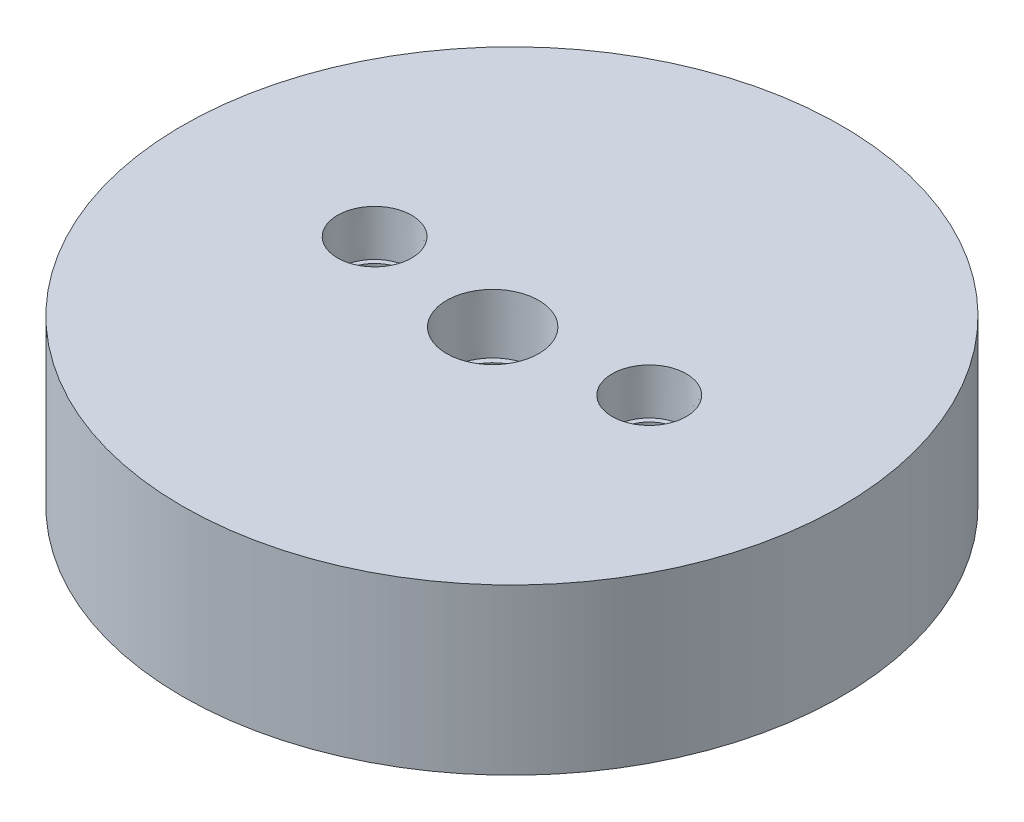
ISO-10303-21;
HEADER;
FILE_DESCRIPTION(('STEP AP214'),'2;1');
FILE_NAME('part.step','',(''),(''),'','','');
FILE_SCHEMA(('AUTOMOTIVE_DESIGN { 1 0 10303 214 1 1 1 1 }'));
ENDSEC;
DATA;
#1=APPLICATION_CONTEXT('core data for automotive mechanical design processes');
#2=APPLICATION_PROTOCOL_DEFINITION('international standard','automotive_design',2000,#1);
#3=PRODUCT_CONTEXT('',#1,'mechanical');
#4=PRODUCT('Part','Part','',(#3));
#5=PRODUCT_RELATED_PRODUCT_CATEGORY('part','',(#4));
#6=PRODUCT_DEFINITION_FORMATION('','',#4);
#7=PRODUCT_DEFINITION_CONTEXT('part definition',#1,'design');
#8=PRODUCT_DEFINITION('design','',#6,#7);
#9=PRODUCT_DEFINITION_SHAPE('','',#8);
#10=(LENGTH_UNIT() NAMED_UNIT(*) SI_UNIT(.MILLI.,.METRE.));
#11=(NAMED_UNIT(*) PLANE_ANGLE_UNIT() SI_UNIT($,.RADIAN.));
#12=(NAMED_UNIT(*) SI_UNIT($,.STERADIAN.) SOLID_ANGLE_UNIT());
#13=UNCERTAINTY_MEASURE_WITH_UNIT(LENGTH_MEASURE(1.E-05),#10,'distance_accuracy_value','');
#14=(GEOMETRIC_REPRESENTATION_CONTEXT(3) GLOBAL_UNCERTAINTY_ASSIGNED_CONTEXT((#13)) GLOBAL_UNIT_ASSIGNED_CONTEXT((#10,
#11,#12)) REPRESENTATION_CONTEXT('',''));
#15=CARTESIAN_POINT('',(0.,0.,0.));
#16=DIRECTION('',(0.,0.,1.));
#17=DIRECTION('',(1.,0.,0.));
#18=AXIS2_PLACEMENT_3D('',#15,#16,#17);
#19=CARTESIAN_POINT('',(0.,-36.83,0.));
#20=DIRECTION('',(0.,-1.,0.));
#21=DIRECTION('',(0.,0.,-1.));
#22=AXIS2_PLACEMENT_3D('',#19,#20,#21);
#23=CYLINDRICAL_SURFACE('',#22,19.05);
#24=CARTESIAN_POINT('',(0.,-40.64,0.));
#25=DIRECTION('',(0.,1.,0.));
#26=DIRECTION('',(0.,0.,1.));
#27=AXIS2_PLACEMENT_3D('',#24,#25,#26);
#28=CIRCLE('',#27,19.05);
#29=CARTESIAN_POINT('',(0.,-40.64,19.05));
#30=VERTEX_POINT('',#29);
#31=EDGE_CURVE('E53',#30,#30,#28,.T.);
#32=ORIENTED_EDGE('',*,*,#31,.F.);
#33=EDGE_LOOP('',(#32));
#34=FACE_BOUND('',#33,.T.);
#35=CARTESIAN_POINT('',(0.,-36.83,0.));
#36=DIRECTION('',(0.,1.,0.));
#37=DIRECTION('',(0.,0.,1.));
#38=AXIS2_PLACEMENT_3D('',#35,#36,#37);
#39=CIRCLE('',#38,19.05);
#40=CARTESIAN_POINT('',(0.,-36.83,19.05));
#41=VERTEX_POINT('',#40);
#42=EDGE_CURVE('E41',#41,#41,#39,.T.);
#43=ORIENTED_EDGE('',*,*,#42,.T.);
#44=EDGE_LOOP('',(#43));
#45=FACE_BOUND('',#44,.T.);
#46=ADVANCED_FACE('F33',(#34,#45),#23,.F.);
#47=CARTESIAN_POINT('',(0.,-36.83,0.));
#48=DIRECTION('',(0.,1.,0.));
#49=DIRECTION('',(0.,0.,1.));
#50=AXIS2_PLACEMENT_3D('',#47,#48,#49);
#51=PLANE('',#50);
#52=CARTESIAN_POINT('',(0.,-36.83,0.));
#53=DIRECTION('',(0.,1.,0.));
#54=DIRECTION('',(0.,0.,1.));
#55=AXIS2_PLACEMENT_3D('',#52,#53,#54);
#56=CIRCLE('',#55,13.97);
#57=CARTESIAN_POINT('',(0.,-36.83,13.97));
#58=VERTEX_POINT('',#57);
#59=EDGE_CURVE('E46',#58,#58,#56,.F.);
#60=ORIENTED_EDGE('',*,*,#59,.F.);
#61=EDGE_LOOP('',(#60));
#62=FACE_BOUND('',#61,.T.);
#63=ORIENTED_EDGE('',*,*,#42,.F.);
#64=EDGE_LOOP('',(#63));
#65=FACE_BOUND('',#64,.T.);
#66=ADVANCED_FACE('F108',(#62,#65),#51,.F.);
#67=CARTESIAN_POINT('',(0.,-30.48,0.));
#68=DIRECTION('',(0.,-1.,0.));
#69=DIRECTION('',(0.,0.,-1.));
#70=AXIS2_PLACEMENT_3D('',#67,#68,#69);
#71=CYLINDRICAL_SURFACE('',#70,13.97);
#72=CARTESIAN_POINT('',(0.,-30.48,0.));
#73=DIRECTION('',(0.,1.,0.));
#74=DIRECTION('',(0.,0.,1.));
#75=AXIS2_PLACEMENT_3D('',#72,#73,#74);
#76=CIRCLE('',#75,13.97);
#77=CARTESIAN_POINT('',(0.,-30.48,13.97));
#78=VERTEX_POINT('',#77);
#79=EDGE_CURVE('E52',#78,#78,#76,.T.);
#80=ORIENTED_EDGE('',*,*,#79,.T.);
#81=EDGE_LOOP('',(#80));
#82=FACE_BOUND('',#81,.T.);
#83=ORIENTED_EDGE('',*,*,#59,.T.);
#84=EDGE_LOOP('',(#83));
#85=FACE_BOUND('',#84,.T.);
#86=ADVANCED_FACE('F93',(#82,#85),#71,.F.);
#87=CARTESIAN_POINT('',(0.,-30.48,0.));
#88=DIRECTION('',(0.,1.,0.));
#89=DIRECTION('',(0.,0.,1.));
#90=AXIS2_PLACEMENT_3D('',#87,#88,#89);
#91=PLANE('',#90);
#92=CARTESIAN_POINT('',(0.,-30.48,4.445));
#93=DIRECTION('',(0.,1.,0.));
#94=DIRECTION('',(0.,0.,1.));
#95=AXIS2_PLACEMENT_3D('',#92,#93,#94);
#96=CIRCLE('',#95,8.9281);
#97=CARTESIAN_POINT('',(0.,-30.48,13.3731));
#98=VERTEX_POINT('',#97);
#99=EDGE_CURVE('E58',#98,#98,#96,.T.);
#100=ORIENTED_EDGE('',*,*,#99,.T.);
#101=EDGE_LOOP('',(#100));
#102=FACE_BOUND('',#101,.T.);
#103=ORIENTED_EDGE('',*,*,#79,.F.);
#104=EDGE_LOOP('',(#103));
#105=FACE_BOUND('',#104,.T.);
#106=ADVANCED_FACE('F96',(#102,#105),#91,.F.);
#107=CARTESIAN_POINT('',(0.,-40.64,0.));
#108=DIRECTION('',(0.,-1.,0.));
#109=DIRECTION('',(0.,0.,-1.));
#110=AXIS2_PLACEMENT_3D('',#107,#108,#109);
#111=CYLINDRICAL_SURFACE('',#110,60.96);
#112=CARTESIAN_POINT('',(0.,-40.64,0.));
#113=DIRECTION('',(0.,1.,0.));
#114=DIRECTION('',(0.,0.,1.));
#115=AXIS2_PLACEMENT_3D('',#112,#113,#114);
#116=CIRCLE('',#115,60.96);
#117=CARTESIAN_POINT('',(0.,-40.64,60.96));
#118=VERTEX_POINT('',#117);
#119=EDGE_CURVE('E57',#118,#118,#116,.T.);
#120=ORIENTED_EDGE('',*,*,#119,.T.);
#121=EDGE_LOOP('',(#120));
#122=FACE_BOUND('',#121,.T.);
#123=CARTESIAN_POINT('',(0.,-50.8,0.));
#124=DIRECTION('',(0.,1.,0.));
#125=DIRECTION('',(0.,0.,1.));
#126=AXIS2_PLACEMENT_3D('',#123,#124,#125);
#127=CIRCLE('',#126,60.96);
#128=CARTESIAN_POINT('',(0.,-50.8,60.96));
#129=VERTEX_POINT('',#128);
#130=EDGE_CURVE('E60',#129,#129,#127,.T.);
#131=ORIENTED_EDGE('',*,*,#130,.F.);
#132=EDGE_LOOP('',(#131));
#133=FACE_BOUND('',#132,.T.);
#134=ADVANCED_FACE('F98',(#122,#133),#111,.F.);
#135=CARTESIAN_POINT('',(0.,-40.64,0.));
#136=DIRECTION('',(0.,1.,0.));
#137=DIRECTION('',(0.,0.,1.));
#138=AXIS2_PLACEMENT_3D('',#135,#136,#137);
#139=PLANE('',#138);
#140=CARTESIAN_POINT('',(-31.75,-40.64,0.));
#141=DIRECTION('',(0.,1.,0.));
#142=DIRECTION('',(0.,0.,1.));
#143=AXIS2_PLACEMENT_3D('',#140,#141,#142);
#144=CIRCLE('',#143,7.1374);
#145=CARTESIAN_POINT('',(-31.75,-40.64,7.1374));
#146=VERTEX_POINT('',#145);
#147=EDGE_CURVE('E37',#146,#146,#144,.T.);
#148=ORIENTED_EDGE('',*,*,#147,.T.);
#149=EDGE_LOOP('',(#148));
#150=FACE_BOUND('',#149,.T.);
#151=CARTESIAN_POINT('',(31.75,-40.64,0.));
#152=DIRECTION('',(0.,1.,0.));
#153=DIRECTION('',(0.,0.,1.));
#154=AXIS2_PLACEMENT_3D('',#151,#152,#153);
#155=CIRCLE('',#154,7.1374);
#156=CARTESIAN_POINT('',(31.75,-40.64,7.1374));
#157=VERTEX_POINT('',#156);
#158=EDGE_CURVE('E62',#157,#157,#155,.T.);
#159=ORIENTED_EDGE('',*,*,#158,.T.);
#160=EDGE_LOOP('',(#159));
#161=FACE_BOUND('',#160,.T.);
#162=ORIENTED_EDGE('',*,*,#31,.T.);
#163=EDGE_LOOP('',(#162));
#164=FACE_BOUND('',#163,.T.);
#165=ORIENTED_EDGE('',*,*,#119,.F.);
#166=EDGE_LOOP('',(#165));
#167=FACE_BOUND('',#166,.T.);
#168=ADVANCED_FACE('F105',(#150,#161,#164,#167),#139,.F.);
#169=CARTESIAN_POINT('',(0.,-12.7,0.));
#170=DIRECTION('',(0.,1.,0.));
#171=DIRECTION('',(0.,0.,1.));
#172=AXIS2_PLACEMENT_3D('',#169,#170,#171);
#173=PLANE('',#172);
#174=CARTESIAN_POINT('',(-31.75,-12.7,0.));
#175=DIRECTION('',(0.,1.,0.));
#176=DIRECTION('',(0.,0.,1.));
#177=AXIS2_PLACEMENT_3D('',#174,#175,#176);
#178=CIRCLE('',#177,8.5750146);
#179=CARTESIAN_POINT('',(-31.75,-12.7,8.5750146));
#180=VERTEX_POINT('',#179);
#181=EDGE_CURVE('E187',#180,#180,#178,.T.);
#182=ORIENTED_EDGE('',*,*,#181,.F.);
#183=EDGE_LOOP('',(#182));
#184=FACE_BOUND('',#183,.T.);
#185=CARTESIAN_POINT('',(31.75,-12.7,0.));
#186=DIRECTION('',(0.,1.,0.));
#187=DIRECTION('',(0.,0.,1.));
#188=AXIS2_PLACEMENT_3D('',#185,#186,#187);
#189=CIRCLE('',#188,8.5750146);
#190=CARTESIAN_POINT('',(31.75,-12.7,8.5750146));
#191=VERTEX_POINT('',#190);
#192=EDGE_CURVE('E77',#191,#191,#189,.T.);
#193=ORIENTED_EDGE('',*,*,#192,.F.);
#194=EDGE_LOOP('',(#193));
#195=FACE_BOUND('',#194,.T.);
#196=CARTESIAN_POINT('',(0.,-12.7,4.445));
#197=DIRECTION('',(0.,1.,0.));
#198=DIRECTION('',(0.,0.,1.));
#199=AXIS2_PLACEMENT_3D('',#196,#197,#198);
#200=CIRCLE('',#199,10.6647361);
#201=CARTESIAN_POINT('',(0.,-12.7,15.1097361));
#202=VERTEX_POINT('',#201);
#203=EDGE_CURVE('E64',#202,#202,#200,.T.);
#204=ORIENTED_EDGE('',*,*,#203,.F.);
#205=EDGE_LOOP('',(#204));
#206=FACE_BOUND('',#205,.T.);
#207=CARTESIAN_POINT('',(0.,-12.7,0.));
#208=DIRECTION('',(0.,1.,0.));
#209=DIRECTION('',(0.,0.,1.));
#210=AXIS2_PLACEMENT_3D('',#207,#208,#209);
#211=CIRCLE('',#210,76.2);
#212=CARTESIAN_POINT('',(0.,-12.7,76.2));
#213=VERTEX_POINT('',#212);
#214=EDGE_CURVE('E56',#213,#213,#211,.T.);
#215=ORIENTED_EDGE('',*,*,#214,.T.);
#216=EDGE_LOOP('',(#215));
#217=FACE_BOUND('',#216,.T.);
#218=ADVANCED_FACE('F132',(#184,#195,#206,#217),#173,.T.);
#219=CARTESIAN_POINT('',(0.,-50.8,0.));
#220=DIRECTION('',(0.,1.,0.));
#221=DIRECTION('',(0.,0.,1.));
#222=AXIS2_PLACEMENT_3D('',#219,#220,#221);
#223=CYLINDRICAL_SURFACE('',#222,76.2);
#224=CARTESIAN_POINT('',(0.,-50.8,0.));
#225=DIRECTION('',(0.,1.,0.));
#226=DIRECTION('',(0.,0.,1.));
#227=AXIS2_PLACEMENT_3D('',#224,#225,#226);
#228=CIRCLE('',#227,76.2);
#229=CARTESIAN_POINT('',(0.,-50.8,76.2));
#230=VERTEX_POINT('',#229);
#231=EDGE_CURVE('E10',#230,#230,#228,.T.);
#232=ORIENTED_EDGE('',*,*,#231,.T.);
#233=EDGE_LOOP('',(#232));
#234=FACE_BOUND('',#233,.T.);
#235=ORIENTED_EDGE('',*,*,#214,.F.);
#236=EDGE_LOOP('',(#235));
#237=FACE_BOUND('',#236,.T.);
#238=ADVANCED_FACE('F35',(#234,#237),#223,.T.);
#239=CARTESIAN_POINT('',(0.,-50.8,0.));
#240=DIRECTION('',(0.,1.,0.));
#241=DIRECTION('',(0.,0.,1.));
#242=AXIS2_PLACEMENT_3D('',#239,#240,#241);
#243=PLANE('',#242);
#244=ORIENTED_EDGE('',*,*,#130,.T.);
#245=EDGE_LOOP('',(#244));
#246=FACE_BOUND('',#245,.T.);
#247=ORIENTED_EDGE('',*,*,#231,.F.);
#248=EDGE_LOOP('',(#247));
#249=FACE_BOUND('',#248,.T.);
#250=ADVANCED_FACE('F121',(#246,#249),#243,.F.);
#251=CARTESIAN_POINT('',(0.,-12.7,4.445));
#252=DIRECTION('',(0.,1.,0.));
#253=DIRECTION('',(0.,0.,1.));
#254=AXIS2_PLACEMENT_3D('',#251,#252,#253);
#255=CYLINDRICAL_SURFACE('',#254,8.9281);
#256=CARTESIAN_POINT('',(0.,-26.162,4.445));
#257=DIRECTION('',(0.,1.,0.));
#258=DIRECTION('',(0.,0.,1.));
#259=AXIS2_PLACEMENT_3D('',#256,#257,#258);
#260=CIRCLE('',#259,8.9281);
#261=CARTESIAN_POINT('',(0.,-26.162,13.3731));
#262=VERTEX_POINT('',#261);
#263=EDGE_CURVE('E61',#262,#262,#260,.T.);
#264=ORIENTED_EDGE('',*,*,#263,.T.);
#265=EDGE_LOOP('',(#264));
#266=FACE_BOUND('',#265,.T.);
#267=ORIENTED_EDGE('',*,*,#99,.F.);
#268=EDGE_LOOP('',(#267));
#269=FACE_BOUND('',#268,.T.);
#270=ADVANCED_FACE('F123',(#266,#269),#255,.F.);
#271=CARTESIAN_POINT('',(8.92810000000001,-26.162,4.445));
#272=DIRECTION('',(0.,-1.,0.));
#273=DIRECTION('',(0.,0.,-1.));
#274=AXIS2_PLACEMENT_3D('',#271,#272,#273);
#275=PLANE('',#274);
#276=ORIENTED_EDGE('',*,*,#263,.F.);
#277=EDGE_LOOP('',(#276));
#278=FACE_BOUND('',#277,.T.);
#279=CARTESIAN_POINT('',(0.,-26.162,4.445));
#280=DIRECTION('',(0.,1.,0.));
#281=DIRECTION('',(0.,0.,1.));
#282=AXIS2_PLACEMENT_3D('',#279,#280,#281);
#283=CIRCLE('',#282,10.2616657920863);
#284=CARTESIAN_POINT('',(0.,-26.162,14.7066657920863));
#285=VERTEX_POINT('',#284);
#286=EDGE_CURVE('E69',#285,#285,#283,.T.);
#287=ORIENTED_EDGE('',*,*,#286,.T.);
#288=EDGE_LOOP('',(#287));
#289=FACE_BOUND('',#288,.T.);
#290=ADVANCED_FACE('F129',(#278,#289),#275,.F.);
#291=CARTESIAN_POINT('',(0.,-12.7,4.445));
#292=DIRECTION('',(0.,1.,0.));
#293=DIRECTION('',(0.,0.,1.));
#294=AXIS2_PLACEMENT_3D('',#291,#292,#293);
#295=CONICAL_SURFACE('',#294,10.6647361,0.0299323966717032);
#296=ORIENTED_EDGE('',*,*,#286,.F.);
#297=EDGE_LOOP('',(#296));
#298=FACE_BOUND('',#297,.T.);
#299=ORIENTED_EDGE('',*,*,#203,.T.);
#300=EDGE_LOOP('',(#299));
#301=FACE_BOUND('',#300,.T.);
#302=ADVANCED_FACE('F153',(#298,#301),#295,.F.);
#303=CARTESIAN_POINT('',(31.75,-12.7,0.));
#304=DIRECTION('',(0.,1.,0.));
#305=DIRECTION('',(0.,0.,1.));
#306=AXIS2_PLACEMENT_3D('',#303,#304,#305);
#307=CYLINDRICAL_SURFACE('',#306,7.1374);
#308=CARTESIAN_POINT('',(31.75,-23.114,0.));
#309=DIRECTION('',(0.,1.,0.));
#310=DIRECTION('',(0.,0.,1.));
#311=AXIS2_PLACEMENT_3D('',#308,#309,#310);
#312=CIRCLE('',#311,7.1374);
#313=CARTESIAN_POINT('',(31.75,-23.114,7.1374));
#314=VERTEX_POINT('',#313);
#315=EDGE_CURVE('E65',#314,#314,#312,.T.);
#316=ORIENTED_EDGE('',*,*,#315,.T.);
#317=EDGE_LOOP('',(#316));
#318=FACE_BOUND('',#317,.T.);
#319=ORIENTED_EDGE('',*,*,#158,.F.);
#320=EDGE_LOOP('',(#319));
#321=FACE_BOUND('',#320,.T.);
#322=ADVANCED_FACE('F157',(#318,#321),#307,.F.);
#323=CARTESIAN_POINT('',(38.8874,-23.114,0.));
#324=DIRECTION('',(0.,-1.,0.));
#325=DIRECTION('',(0.,0.,-1.));
#326=AXIS2_PLACEMENT_3D('',#323,#324,#325);
#327=PLANE('',#326);
#328=ORIENTED_EDGE('',*,*,#315,.F.);
#329=EDGE_LOOP('',(#328));
#330=FACE_BOUND('',#329,.T.);
#331=CARTESIAN_POINT('',(31.75,-23.114,0.));
#332=DIRECTION('',(0.,1.,0.));
#333=DIRECTION('',(0.,0.,1.));
#334=AXIS2_PLACEMENT_3D('',#331,#332,#333);
#335=CIRCLE('',#334,8.26320549387809);
#336=CARTESIAN_POINT('',(31.75,-23.114,8.26320549387809));
#337=VERTEX_POINT('',#336);
#338=EDGE_CURVE('E72',#337,#337,#335,.T.);
#339=ORIENTED_EDGE('',*,*,#338,.T.);
#340=EDGE_LOOP('',(#339));
#341=FACE_BOUND('',#340,.T.);
#342=ADVANCED_FACE('F161',(#330,#341),#327,.F.);
#343=CARTESIAN_POINT('',(31.75,-12.7,0.));
#344=DIRECTION('',(0.,1.,0.));
#345=DIRECTION('',(0.,0.,1.));
#346=AXIS2_PLACEMENT_3D('',#343,#344,#345);
#347=CONICAL_SURFACE('',#346,8.5750146,0.0299323966717029);
#348=ORIENTED_EDGE('',*,*,#338,.F.);
#349=EDGE_LOOP('',(#348));
#350=FACE_BOUND('',#349,.T.);
#351=ORIENTED_EDGE('',*,*,#192,.T.);
#352=EDGE_LOOP('',(#351));
#353=FACE_BOUND('',#352,.T.);
#354=ADVANCED_FACE('F164',(#350,#353),#347,.F.);
#355=CARTESIAN_POINT('',(-31.75,-12.7,0.));
#356=DIRECTION('',(0.,1.,0.));
#357=DIRECTION('',(0.,0.,1.));
#358=AXIS2_PLACEMENT_3D('',#355,#356,#357);
#359=CYLINDRICAL_SURFACE('',#358,7.1374);
#360=CARTESIAN_POINT('',(-31.75,-23.114,0.));
#361=DIRECTION('',(0.,1.,0.));
#362=DIRECTION('',(0.,0.,1.));
#363=AXIS2_PLACEMENT_3D('',#360,#361,#362);
#364=CIRCLE('',#363,7.1374);
#365=CARTESIAN_POINT('',(-31.75,-23.114,7.1374));
#366=VERTEX_POINT('',#365);
#367=EDGE_CURVE('E189',#366,#366,#364,.T.);
#368=ORIENTED_EDGE('',*,*,#367,.T.);
#369=EDGE_LOOP('',(#368));
#370=FACE_BOUND('',#369,.T.);
#371=ORIENTED_EDGE('',*,*,#147,.F.);
#372=EDGE_LOOP('',(#371));
#373=FACE_BOUND('',#372,.T.);
#374=ADVANCED_FACE('F168',(#370,#373),#359,.F.);
#375=CARTESIAN_POINT('',(-24.6126,-23.114,0.));
#376=DIRECTION('',(0.,-1.,0.));
#377=DIRECTION('',(0.,0.,-1.));
#378=AXIS2_PLACEMENT_3D('',#375,#376,#377);
#379=PLANE('',#378);
#380=ORIENTED_EDGE('',*,*,#367,.F.);
#381=EDGE_LOOP('',(#380));
#382=FACE_BOUND('',#381,.T.);
#383=CARTESIAN_POINT('',(-31.75,-23.114,0.));
#384=DIRECTION('',(0.,1.,0.));
#385=DIRECTION('',(0.,0.,1.));
#386=AXIS2_PLACEMENT_3D('',#383,#384,#385);
#387=CIRCLE('',#386,8.26320549387809);
#388=CARTESIAN_POINT('',(-31.75,-23.114,8.26320549387809));
#389=VERTEX_POINT('',#388);
#390=EDGE_CURVE('E185',#389,#389,#387,.T.);
#391=ORIENTED_EDGE('',*,*,#390,.T.);
#392=EDGE_LOOP('',(#391));
#393=FACE_BOUND('',#392,.T.);
#394=ADVANCED_FACE('F172',(#382,#393),#379,.F.);
#395=CARTESIAN_POINT('',(-31.75,-12.7,0.));
#396=DIRECTION('',(0.,1.,0.));
#397=DIRECTION('',(0.,0.,1.));
#398=AXIS2_PLACEMENT_3D('',#395,#396,#397);
#399=CONICAL_SURFACE('',#398,8.5750146,0.0299323966717026);
#400=ORIENTED_EDGE('',*,*,#390,.F.);
#401=EDGE_LOOP('',(#400));
#402=FACE_BOUND('',#401,.T.);
#403=ORIENTED_EDGE('',*,*,#181,.T.);
#404=EDGE_LOOP('',(#403));
#405=FACE_BOUND('',#404,.T.);
#406=ADVANCED_FACE('F176',(#402,#405),#399,.F.);
#407=CLOSED_SHELL('',(#46,#66,#86,#106,#134,#168,#218,#238,#250,#270,#290,#302,#322,#342,#354,
#374,#394,#406));
#408=MANIFOLD_SOLID_BREP('B2',#407);
#409=ADVANCED_BREP_SHAPE_REPRESENTATION('',(#18,#408),#14);
#410=SHAPE_DEFINITION_REPRESENTATION(#9,#409);
ENDSEC;
END-ISO-10303-21;
